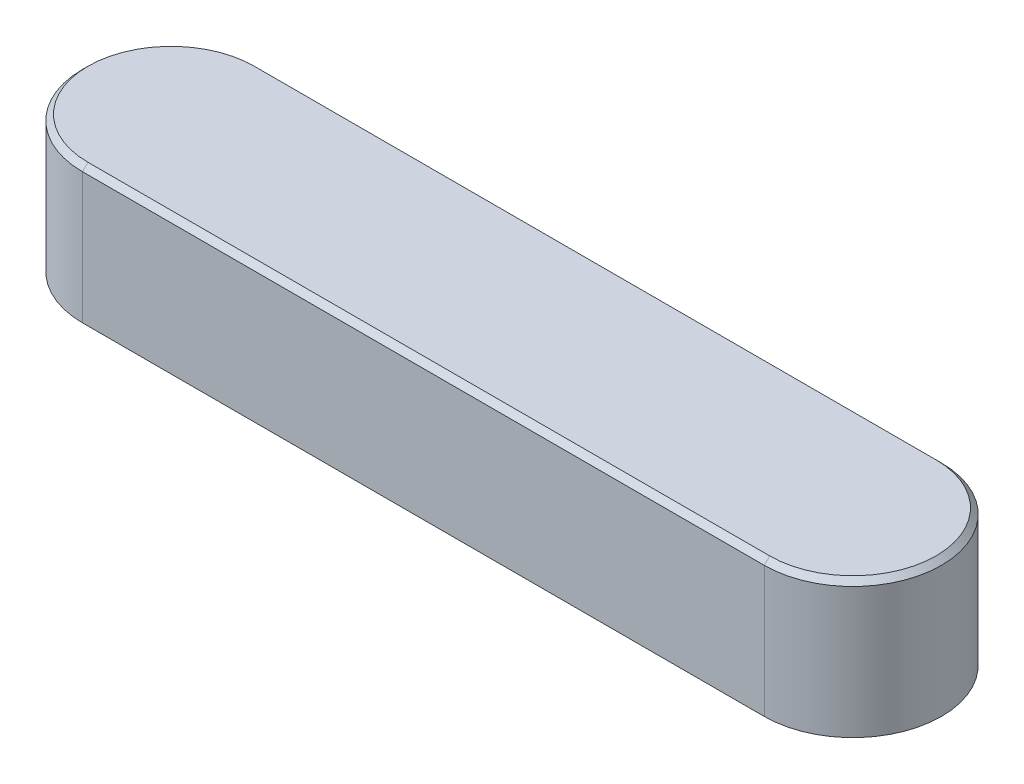
ISO-10303-21;
HEADER;
FILE_DESCRIPTION(('STEP AP214'),'2;1');
FILE_NAME('part.step','',(''),(''),'','','');
FILE_SCHEMA(('AUTOMOTIVE_DESIGN { 1 0 10303 214 1 1 1 1 }'));
ENDSEC;
DATA;
#1=APPLICATION_CONTEXT('core data for automotive mechanical design processes');
#2=APPLICATION_PROTOCOL_DEFINITION('international standard','automotive_design',2000,#1);
#3=PRODUCT_CONTEXT('',#1,'mechanical');
#4=PRODUCT('Part','Part','',(#3));
#5=PRODUCT_RELATED_PRODUCT_CATEGORY('part','',(#4));
#6=PRODUCT_DEFINITION_FORMATION('','',#4);
#7=PRODUCT_DEFINITION_CONTEXT('part definition',#1,'design');
#8=PRODUCT_DEFINITION('design','',#6,#7);
#9=PRODUCT_DEFINITION_SHAPE('','',#8);
#10=(LENGTH_UNIT() NAMED_UNIT(*) SI_UNIT(.MILLI.,.METRE.));
#11=(NAMED_UNIT(*) PLANE_ANGLE_UNIT() SI_UNIT($,.RADIAN.));
#12=(NAMED_UNIT(*) SI_UNIT($,.STERADIAN.) SOLID_ANGLE_UNIT());
#13=UNCERTAINTY_MEASURE_WITH_UNIT(LENGTH_MEASURE(1.E-05),#10,'distance_accuracy_value','');
#14=(GEOMETRIC_REPRESENTATION_CONTEXT(3) GLOBAL_UNCERTAINTY_ASSIGNED_CONTEXT((#13)) GLOBAL_UNIT_ASSIGNED_CONTEXT((#10,
#11,#12)) REPRESENTATION_CONTEXT('',''));
#15=CARTESIAN_POINT('',(0.,0.,0.));
#16=DIRECTION('',(0.,0.,1.));
#17=DIRECTION('',(1.,0.,0.));
#18=AXIS2_PLACEMENT_3D('',#15,#16,#17);
#19=CARTESIAN_POINT('',(-8.64197530864198,5.,0.));
#20=DIRECTION('',(0.,-1.,0.));
#21=DIRECTION('',(0.,0.,-1.));
#22=AXIS2_PLACEMENT_3D('',#19,#20,#21);
#23=CYLINDRICAL_SURFACE('',#22,3.25);
#24=DIRECTION('',(0.,-1.,0.));
#25=VECTOR('',#24,1.);
#26=CARTESIAN_POINT('',(-8.64197530864198,5.,3.25));
#27=LINE('',#26,#25);
#28=CARTESIAN_POINT('',(-8.64197530864198,4.79999999999999,3.25));
#29=VERTEX_POINT('',#28);
#30=CARTESIAN_POINT('',(-8.64197530864198,0.,3.25));
#31=VERTEX_POINT('',#30);
#32=EDGE_CURVE('E97',#29,#31,#27,.T.);
#33=ORIENTED_EDGE('',*,*,#32,.F.);
#34=CARTESIAN_POINT('',(-8.64197530864198,4.79999999999999,0.));
#35=DIRECTION('',(0.,1.,0.));
#36=DIRECTION('',(0.,0.,1.));
#37=AXIS2_PLACEMENT_3D('',#34,#35,#36);
#38=CIRCLE('',#37,3.25);
#39=CARTESIAN_POINT('',(-8.64197530864198,4.79999999999999,-3.25));
#40=VERTEX_POINT('',#39);
#41=EDGE_CURVE('E11',#29,#40,#38,.F.);
#42=ORIENTED_EDGE('',*,*,#41,.T.);
#43=DIRECTION('',(0.,-1.,0.));
#44=VECTOR('',#43,1.);
#45=CARTESIAN_POINT('',(-8.64197530864198,5.,-3.25));
#46=LINE('',#45,#44);
#47=CARTESIAN_POINT('',(-8.64197530864198,0.,-3.25));
#48=VERTEX_POINT('',#47);
#49=EDGE_CURVE('E119',#40,#48,#46,.T.);
#50=ORIENTED_EDGE('',*,*,#49,.T.);
#51=CARTESIAN_POINT('',(-8.64197530864198,0.,0.));
#52=DIRECTION('',(0.,1.,0.));
#53=DIRECTION('',(0.,0.,1.));
#54=AXIS2_PLACEMENT_3D('',#51,#52,#53);
#55=CIRCLE('',#54,3.25);
#56=EDGE_CURVE('E113',#48,#31,#55,.T.);
#57=ORIENTED_EDGE('',*,*,#56,.T.);
#58=EDGE_LOOP('',(#33,#42,#50,#57));
#59=FACE_BOUND('',#58,.T.);
#60=ADVANCED_FACE('F43',(#59),#23,.T.);
#61=CARTESIAN_POINT('',(-8.64197530864198,5.,3.25));
#62=DIRECTION('',(0.,0.,-1.));
#63=DIRECTION('',(-1.,0.,0.));
#64=AXIS2_PLACEMENT_3D('',#61,#62,#63);
#65=PLANE('',#64);
#66=DIRECTION('',(0.,-1.,0.));
#67=VECTOR('',#66,1.);
#68=CARTESIAN_POINT('',(16.358024691358,5.,3.25));
#69=LINE('',#68,#67);
#70=CARTESIAN_POINT('',(16.358024691358,4.79999999999999,3.25));
#71=VERTEX_POINT('',#70);
#72=CARTESIAN_POINT('',(16.358024691358,0.,3.25));
#73=VERTEX_POINT('',#72);
#74=EDGE_CURVE('E107',#71,#73,#69,.T.);
#75=ORIENTED_EDGE('',*,*,#74,.F.);
#76=DIRECTION('',(-1.,0.,0.));
#77=VECTOR('',#76,1.);
#78=CARTESIAN_POINT('',(-8.64197530864198,4.79999999999999,3.25));
#79=LINE('',#78,#77);
#80=EDGE_CURVE('E54',#71,#29,#79,.T.);
#81=ORIENTED_EDGE('',*,*,#80,.T.);
#82=ORIENTED_EDGE('',*,*,#32,.T.);
#83=DIRECTION('',(1.,0.,0.));
#84=VECTOR('',#83,1.);
#85=CARTESIAN_POINT('',(-8.64197530864198,0.,3.25));
#86=LINE('',#85,#84);
#87=EDGE_CURVE('E100',#31,#73,#86,.T.);
#88=ORIENTED_EDGE('',*,*,#87,.T.);
#89=EDGE_LOOP('',(#75,#81,#82,#88));
#90=FACE_BOUND('',#89,.T.);
#91=ADVANCED_FACE('F99',(#90),#65,.F.);
#92=CARTESIAN_POINT('',(16.358024691358,5.,0.));
#93=DIRECTION('',(0.,-1.,0.));
#94=DIRECTION('',(0.,0.,-1.));
#95=AXIS2_PLACEMENT_3D('',#92,#93,#94);
#96=CYLINDRICAL_SURFACE('',#95,3.25);
#97=DIRECTION('',(0.,-1.,0.));
#98=VECTOR('',#97,1.);
#99=CARTESIAN_POINT('',(16.358024691358,5.,-3.25));
#100=LINE('',#99,#98);
#101=CARTESIAN_POINT('',(16.358024691358,4.79999999999999,-3.25));
#102=VERTEX_POINT('',#101);
#103=CARTESIAN_POINT('',(16.358024691358,0.,-3.25));
#104=VERTEX_POINT('',#103);
#105=EDGE_CURVE('E134',#102,#104,#100,.T.);
#106=ORIENTED_EDGE('',*,*,#105,.F.);
#107=CARTESIAN_POINT('',(16.358024691358,4.79999999999999,0.));
#108=DIRECTION('',(0.,1.,0.));
#109=DIRECTION('',(0.,0.,1.));
#110=AXIS2_PLACEMENT_3D('',#107,#108,#109);
#111=CIRCLE('',#110,3.25);
#112=EDGE_CURVE('E69',#102,#71,#111,.F.);
#113=ORIENTED_EDGE('',*,*,#112,.T.);
#114=ORIENTED_EDGE('',*,*,#74,.T.);
#115=CARTESIAN_POINT('',(16.358024691358,0.,0.));
#116=DIRECTION('',(0.,1.,0.));
#117=DIRECTION('',(0.,0.,1.));
#118=AXIS2_PLACEMENT_3D('',#115,#116,#117);
#119=CIRCLE('',#118,3.25);
#120=EDGE_CURVE('E115',#73,#104,#119,.T.);
#121=ORIENTED_EDGE('',*,*,#120,.T.);
#122=EDGE_LOOP('',(#106,#113,#114,#121));
#123=FACE_BOUND('',#122,.T.);
#124=ADVANCED_FACE('F184',(#123),#96,.T.);
#125=CARTESIAN_POINT('',(-8.64197530864198,5.,-3.25));
#126=DIRECTION('',(0.,0.,1.));
#127=DIRECTION('',(1.,0.,0.));
#128=AXIS2_PLACEMENT_3D('',#125,#126,#127);
#129=PLANE('',#128);
#130=ORIENTED_EDGE('',*,*,#49,.F.);
#131=DIRECTION('',(1.,0.,0.));
#132=VECTOR('',#131,1.);
#133=CARTESIAN_POINT('',(16.358024691358,4.79999999999999,-3.25));
#134=LINE('',#133,#132);
#135=EDGE_CURVE('E151',#40,#102,#134,.T.);
#136=ORIENTED_EDGE('',*,*,#135,.T.);
#137=ORIENTED_EDGE('',*,*,#105,.T.);
#138=DIRECTION('',(-1.,0.,0.));
#139=VECTOR('',#138,1.);
#140=CARTESIAN_POINT('',(-8.64197530864198,0.,-3.25));
#141=LINE('',#140,#139);
#142=EDGE_CURVE('E129',#104,#48,#141,.T.);
#143=ORIENTED_EDGE('',*,*,#142,.T.);
#144=EDGE_LOOP('',(#130,#136,#137,#143));
#145=FACE_BOUND('',#144,.T.);
#146=ADVANCED_FACE('F183',(#145),#129,.F.);
#147=CARTESIAN_POINT('',(-8.64197530864198,5.,0.));
#148=DIRECTION('',(0.,1.,0.));
#149=DIRECTION('',(0.,0.,1.));
#150=AXIS2_PLACEMENT_3D('',#147,#148,#149);
#151=PLANE('',#150);
#152=CARTESIAN_POINT('',(16.358024691358,5.,0.));
#153=DIRECTION('',(0.,1.,0.));
#154=DIRECTION('',(0.,0.,1.));
#155=AXIS2_PLACEMENT_3D('',#152,#153,#154);
#156=CIRCLE('',#155,3.04999999999999);
#157=CARTESIAN_POINT('',(16.358024691358,5.,3.04999999999999));
#158=VERTEX_POINT('',#157);
#159=CARTESIAN_POINT('',(16.358024691358,5.,-3.04999999999999));
#160=VERTEX_POINT('',#159);
#161=EDGE_CURVE('E144',#158,#160,#156,.T.);
#162=ORIENTED_EDGE('',*,*,#161,.T.);
#163=DIRECTION('',(-1.,0.,0.));
#164=VECTOR('',#163,1.);
#165=CARTESIAN_POINT('',(-8.64197530864198,5.,-3.04999999999999));
#166=LINE('',#165,#164);
#167=CARTESIAN_POINT('',(-8.64197530864198,5.,-3.04999999999999));
#168=VERTEX_POINT('',#167);
#169=EDGE_CURVE('E147',#160,#168,#166,.T.);
#170=ORIENTED_EDGE('',*,*,#169,.T.);
#171=CARTESIAN_POINT('',(-8.64197530864198,5.,0.));
#172=DIRECTION('',(0.,1.,0.));
#173=DIRECTION('',(0.,0.,1.));
#174=AXIS2_PLACEMENT_3D('',#171,#172,#173);
#175=CIRCLE('',#174,3.04999999999999);
#176=CARTESIAN_POINT('',(-8.64197530864198,5.,3.04999999999999));
#177=VERTEX_POINT('',#176);
#178=EDGE_CURVE('E106',#168,#177,#175,.T.);
#179=ORIENTED_EDGE('',*,*,#178,.T.);
#180=DIRECTION('',(1.,0.,0.));
#181=VECTOR('',#180,1.);
#182=CARTESIAN_POINT('',(16.358024691358,5.,3.04999999999999));
#183=LINE('',#182,#181);
#184=EDGE_CURVE('E141',#177,#158,#183,.T.);
#185=ORIENTED_EDGE('',*,*,#184,.T.);
#186=EDGE_LOOP('',(#162,#170,#179,#185));
#187=FACE_BOUND('',#186,.T.);
#188=ADVANCED_FACE('F176',(#187),#151,.T.);
#189=CARTESIAN_POINT('',(-8.64197530864198,0.,0.));
#190=DIRECTION('',(0.,1.,0.));
#191=DIRECTION('',(0.,0.,1.));
#192=AXIS2_PLACEMENT_3D('',#189,#190,#191);
#193=PLANE('',#192);
#194=ORIENTED_EDGE('',*,*,#56,.F.);
#195=ORIENTED_EDGE('',*,*,#142,.F.);
#196=ORIENTED_EDGE('',*,*,#120,.F.);
#197=ORIENTED_EDGE('',*,*,#87,.F.);
#198=EDGE_LOOP('',(#194,#195,#196,#197));
#199=FACE_BOUND('',#198,.T.);
#200=ADVANCED_FACE('F111',(#199),#193,.F.);
#201=CARTESIAN_POINT('',(-8.64197530864198,5.,3.04999999999999));
#202=DIRECTION('',(0.,0.707106781186548,0.707106781186548));
#203=DIRECTION('',(-1.,0.,0.));
#204=AXIS2_PLACEMENT_3D('',#201,#202,#203);
#205=PLANE('',#204);
#206=DIRECTION('',(0.,0.707106781186548,-0.707106781186548));
#207=VECTOR('',#206,1.);
#208=CARTESIAN_POINT('',(-8.64197530864198,4.79999999999999,3.25));
#209=LINE('',#208,#207);
#210=EDGE_CURVE('E125',#29,#177,#209,.T.);
#211=ORIENTED_EDGE('',*,*,#210,.F.);
#212=ORIENTED_EDGE('',*,*,#80,.F.);
#213=DIRECTION('',(0.,-0.707106781186548,0.707106781186548));
#214=VECTOR('',#213,1.);
#215=CARTESIAN_POINT('',(16.358024691358,5.,3.04999999999999));
#216=LINE('',#215,#214);
#217=EDGE_CURVE('E48',#158,#71,#216,.T.);
#218=ORIENTED_EDGE('',*,*,#217,.F.);
#219=ORIENTED_EDGE('',*,*,#184,.F.);
#220=EDGE_LOOP('',(#211,#212,#218,#219));
#221=FACE_BOUND('',#220,.T.);
#222=ADVANCED_FACE('F46',(#221),#205,.T.);
#223=CARTESIAN_POINT('',(16.358024691358,5.,0.));
#224=DIRECTION('',(0.,-1.,0.));
#225=DIRECTION('',(0.,0.,-1.));
#226=AXIS2_PLACEMENT_3D('',#223,#224,#225);
#227=CONICAL_SURFACE('',#226,3.04999999999999,0.785398163397448);
#228=ORIENTED_EDGE('',*,*,#217,.T.);
#229=ORIENTED_EDGE('',*,*,#112,.F.);
#230=DIRECTION('',(0.,-0.707106781186548,-0.707106781186548));
#231=VECTOR('',#230,1.);
#232=CARTESIAN_POINT('',(16.358024691358,5.,-3.04999999999999));
#233=LINE('',#232,#231);
#234=EDGE_CURVE('E162',#160,#102,#233,.T.);
#235=ORIENTED_EDGE('',*,*,#234,.F.);
#236=ORIENTED_EDGE('',*,*,#161,.F.);
#237=EDGE_LOOP('',(#228,#229,#235,#236));
#238=FACE_BOUND('',#237,.T.);
#239=ADVANCED_FACE('F208',(#238),#227,.T.);
#240=CARTESIAN_POINT('',(-8.64197530864198,5.,0.));
#241=DIRECTION('',(0.,-1.,0.));
#242=DIRECTION('',(0.,0.,-1.));
#243=AXIS2_PLACEMENT_3D('',#240,#241,#242);
#244=CONICAL_SURFACE('',#243,3.04999999999999,0.785398163397448);
#245=ORIENTED_EDGE('',*,*,#210,.T.);
#246=ORIENTED_EDGE('',*,*,#178,.F.);
#247=DIRECTION('',(0.,0.707106781186548,0.707106781186548));
#248=VECTOR('',#247,1.);
#249=CARTESIAN_POINT('',(-8.64197530864198,4.79999999999999,-3.25));
#250=LINE('',#249,#248);
#251=EDGE_CURVE('E159',#40,#168,#250,.T.);
#252=ORIENTED_EDGE('',*,*,#251,.F.);
#253=ORIENTED_EDGE('',*,*,#41,.F.);
#254=EDGE_LOOP('',(#245,#246,#252,#253));
#255=FACE_BOUND('',#254,.T.);
#256=ADVANCED_FACE('F169',(#255),#244,.T.);
#257=CARTESIAN_POINT('',(-8.64197530864198,5.,-3.04999999999999));
#258=DIRECTION('',(0.,0.707106781186548,-0.707106781186548));
#259=DIRECTION('',(1.,0.,0.));
#260=AXIS2_PLACEMENT_3D('',#257,#258,#259);
#261=PLANE('',#260);
#262=ORIENTED_EDGE('',*,*,#234,.T.);
#263=ORIENTED_EDGE('',*,*,#135,.F.);
#264=ORIENTED_EDGE('',*,*,#251,.T.);
#265=ORIENTED_EDGE('',*,*,#169,.F.);
#266=EDGE_LOOP('',(#262,#263,#264,#265));
#267=FACE_BOUND('',#266,.T.);
#268=ADVANCED_FACE('F180',(#267),#261,.T.);
#269=CLOSED_SHELL('',(#60,#91,#124,#146,#188,#200,#222,#239,#256,#268));
#270=MANIFOLD_SOLID_BREP('B2',#269);
#271=ADVANCED_BREP_SHAPE_REPRESENTATION('',(#18,#270),#14);
#272=SHAPE_DEFINITION_REPRESENTATION(#9,#271);
ENDSEC;
END-ISO-10303-21;
